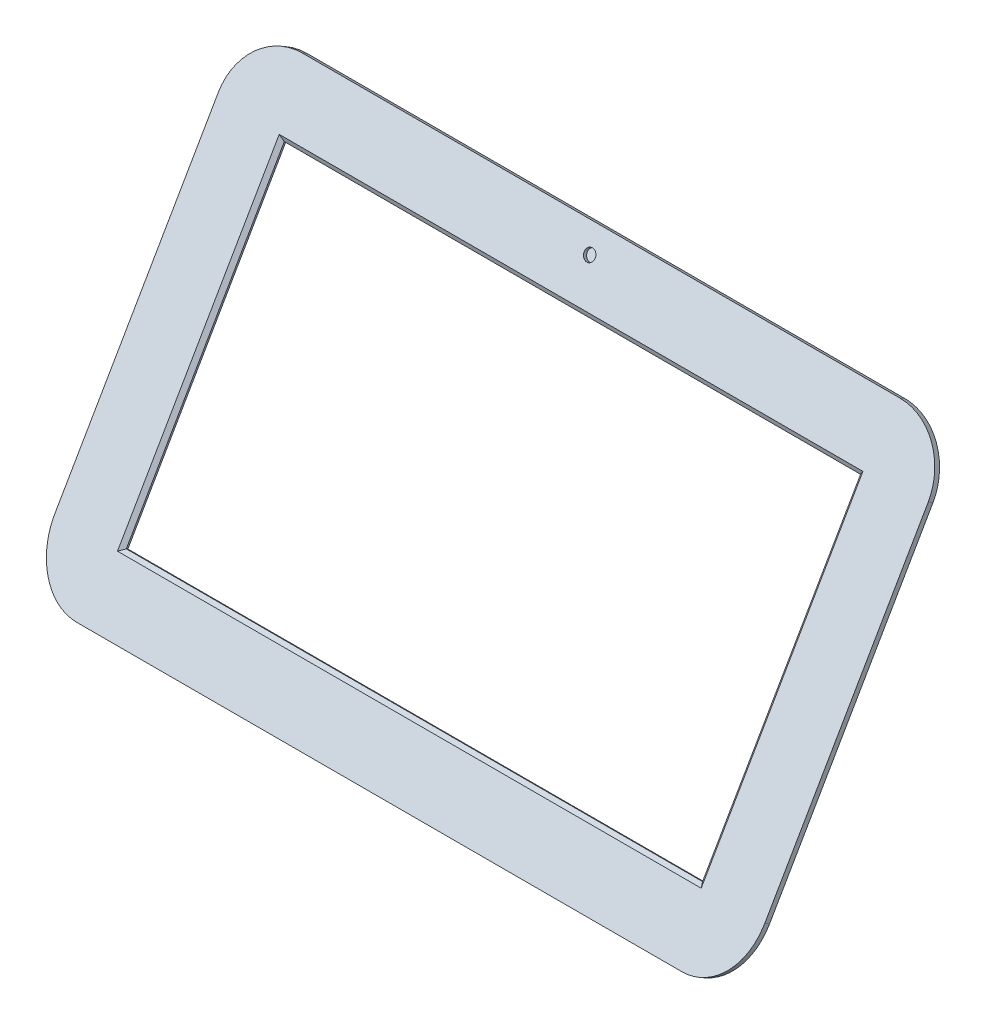
ISO-10303-21;
HEADER;
FILE_DESCRIPTION(('STEP AP214'),'2;1');
FILE_NAME('part.step','',(''),(''),'','','');
FILE_SCHEMA(('AUTOMOTIVE_DESIGN { 1 0 10303 214 1 1 1 1 }'));
ENDSEC;
DATA;
#1=APPLICATION_CONTEXT('core data for automotive mechanical design processes');
#2=APPLICATION_PROTOCOL_DEFINITION('international standard','automotive_design',2000,#1);
#3=PRODUCT_CONTEXT('',#1,'mechanical');
#4=PRODUCT('Part','Part','',(#3));
#5=PRODUCT_RELATED_PRODUCT_CATEGORY('part','',(#4));
#6=PRODUCT_DEFINITION_FORMATION('','',#4);
#7=PRODUCT_DEFINITION_CONTEXT('part definition',#1,'design');
#8=PRODUCT_DEFINITION('design','',#6,#7);
#9=PRODUCT_DEFINITION_SHAPE('','',#8);
#10=(LENGTH_UNIT() NAMED_UNIT(*) SI_UNIT(.MILLI.,.METRE.));
#11=(NAMED_UNIT(*) PLANE_ANGLE_UNIT() SI_UNIT($,.RADIAN.));
#12=(NAMED_UNIT(*) SI_UNIT($,.STERADIAN.) SOLID_ANGLE_UNIT());
#13=UNCERTAINTY_MEASURE_WITH_UNIT(LENGTH_MEASURE(1.E-05),#10,'distance_accuracy_value','');
#14=(GEOMETRIC_REPRESENTATION_CONTEXT(3) GLOBAL_UNCERTAINTY_ASSIGNED_CONTEXT((#13)) GLOBAL_UNIT_ASSIGNED_CONTEXT((#10,
#11,#12)) REPRESENTATION_CONTEXT('',''));
#15=CARTESIAN_POINT('',(0.,0.,0.));
#16=DIRECTION('',(0.,0.,1.));
#17=DIRECTION('',(1.,0.,0.));
#18=AXIS2_PLACEMENT_3D('',#15,#16,#17);
#19=CARTESIAN_POINT('',(-91.243368471321,97.8098890175609,8.79738343873433));
#20=DIRECTION('',(0.,-0.500000000000013,-0.866025403784431));
#21=DIRECTION('',(0.,0.866025403784431,-0.500000000000013));
#22=AXIS2_PLACEMENT_3D('',#19,#20,#21);
#23=PLANE('',#22);
#24=DIRECTION('',(0.,-0.866025403784431,0.500000000000013));
#25=VECTOR('',#24,1.);
#26=CARTESIAN_POINT('',(-77.5000000000063,86.5510975370766,15.2976497307421));
#27=LINE('',#26,#25);
#28=CARTESIAN_POINT('',(-77.5000000000064,86.5510975370772,15.2976497307417));
#29=VERTEX_POINT('',#28);
#30=CARTESIAN_POINT('',(-77.5000000000063,12.9389382154005,57.7976497307428));
#31=VERTEX_POINT('',#30);
#32=EDGE_CURVE('E152',#29,#31,#27,.T.);
#33=ORIENTED_EDGE('',*,*,#32,.T.);
#34=DIRECTION('',(1.,0.,0.));
#35=VECTOR('',#34,1.);
#36=CARTESIAN_POINT('',(-77.5000000000063,12.9389382154005,57.7976497307428));
#37=LINE('',#36,#35);
#38=CARTESIAN_POINT('',(77.4999999999937,12.9389382154005,57.7976497307428));
#39=VERTEX_POINT('',#38);
#40=EDGE_CURVE('E136',#31,#39,#37,.T.);
#41=ORIENTED_EDGE('',*,*,#40,.T.);
#42=DIRECTION('',(0.,-0.866025403784431,0.500000000000013));
#43=VECTOR('',#42,1.);
#44=CARTESIAN_POINT('',(77.4999999999937,86.5510975370765,15.2976497307421));
#45=LINE('',#44,#43);
#46=CARTESIAN_POINT('',(77.4999999999937,86.5510975370772,15.2976497307417));
#47=VERTEX_POINT('',#46);
#48=EDGE_CURVE('E160',#47,#39,#45,.T.);
#49=ORIENTED_EDGE('',*,*,#48,.F.);
#50=DIRECTION('',(1.,0.,0.));
#51=VECTOR('',#50,1.);
#52=CARTESIAN_POINT('',(-77.5000000000063,86.5510975370772,15.2976497307417));
#53=LINE('',#52,#51);
#54=EDGE_CURVE('E158',#29,#47,#53,.T.);
#55=ORIENTED_EDGE('',*,*,#54,.F.);
#56=EDGE_LOOP('',(#33,#41,#49,#55));
#57=FACE_BOUND('',#56,.T.);
#58=CARTESIAN_POINT('',(-80.4040299944083,101.397696376374,6.72596189432287));
#59=CARTESIAN_POINT('',(-81.3948223548655,101.397696376374,6.7259618943229));
#60=CARTESIAN_POINT('',(-82.3692781383816,101.31449137796,6.77400032255501));
#61=CARTESIAN_POINT('',(-83.8074395657664,101.069881022899,6.91522617689611));
#62=CARTESIAN_POINT('',(-84.2828775838439,100.968230667619,6.97391403688055));
#63=CARTESIAN_POINT('',(-85.2256744902742,100.72378155869,7.11504679572367));
#64=CARTESIAN_POINT('',(-85.6946693597111,100.580197274862,7.19794522064315));
#65=CARTESIAN_POINT('',(-87.0598005687776,100.096022316201,7.47748376336091));
#66=CARTESIAN_POINT('',(-87.9235229743241,99.7007861257322,7.70567348432175));
#67=CARTESIAN_POINT('',(-89.1501259978174,99.0001385666802,8.11019254114745));
#68=CARTESIAN_POINT('',(-89.5480970957303,98.7480201437356,8.2557531805022));
#69=CARTESIAN_POINT('',(-90.3171091558551,98.2081560492756,8.5674438607645));
#70=CARTESIAN_POINT('',(-90.6831334808004,97.9240298776957,8.73148418240996));
#71=CARTESIAN_POINT('',(-91.7274993904246,97.030403828854,9.24741942226359));
#72=CARTESIAN_POINT('',(-92.3526437386761,96.3800479708188,9.62290255196924));
#73=CARTESIAN_POINT('',(-93.1811945646513,95.3206738963222,10.2345324590524));
#74=CARTESIAN_POINT('',(-93.4393332415242,94.9525000148915,10.447097748605));
#75=CARTESIAN_POINT('',(-93.9071762318826,94.2040498324152,10.8792156629327));
#76=CARTESIAN_POINT('',(-94.3298498559009,93.4397180496242,11.3205028234773));
#77=CARTESIAN_POINT('',(-94.6636604753382,92.6441419338732,11.7798289080669));
#78=CARTESIAN_POINT('',(-94.952479334074,91.8327466641511,12.2482881854602));
#79=CARTESIAN_POINT('',(-95.0747206558578,91.4176858719899,12.4879236455446));
#80=CARTESIAN_POINT('',(-95.3688217585001,90.1578936145905,13.2152650444771));
#81=CARTESIAN_POINT('',(-95.4671375009985,89.3088650710415,13.7054519026448));
#82=CARTESIAN_POINT('',(-95.4671375009985,88.450616589797,14.2009618943229));
#83=B_SPLINE_CURVE_WITH_KNOTS('',3,(#58,#59,#60,#61,#62,#63,#64,#65,#66,#67,#68,#69,#70,#71,#72,
#73,#74,#75,#76,#77,#78,#79,#80,#81,#82),.UNSPECIFIED.,.F.,.F.,(4,2,2,2,2,2,2,2,2,1,2,2,4),(0.,
0.125000000000001,0.187500000000001,0.250000000000002,0.375000000000002,0.437500000000003,
0.500000000000004,0.625000000000005,0.687500000000004,0.750000000000003,0.812500000000002,
0.875000000000002,1.),.UNSPECIFIED.);
#84=CARTESIAN_POINT('',(-80.4040299944083,101.397696376374,6.72596189432292));
#85=VERTEX_POINT('',#84);
#86=CARTESIAN_POINT('',(-95.4671375009985,88.450616589797,14.200961894323));
#87=VERTEX_POINT('',#86);
#88=EDGE_CURVE('E171',#85,#87,#83,.T.);
#89=ORIENTED_EDGE('',*,*,#88,.F.);
#90=DIRECTION('',(-1.,0.,0.));
#91=VECTOR('',#90,1.);
#92=CARTESIAN_POINT('',(80.4040299944083,101.397696376374,6.7259618943229));
#93=LINE('',#92,#91);
#94=CARTESIAN_POINT('',(80.4040299944083,101.397696376374,6.72596189432292));
#95=VERTEX_POINT('',#94);
#96=EDGE_CURVE('E172',#95,#85,#93,.T.);
#97=ORIENTED_EDGE('',*,*,#96,.F.);
#98=CARTESIAN_POINT('',(95.4671375009985,88.450616589797,14.200961894323));
#99=CARTESIAN_POINT('',(95.4671375009985,89.3087376787211,13.7055254526353));
#100=CARTESIAN_POINT('',(95.3688626037767,90.1523443810771,13.2184688959399));
#101=CARTESIAN_POINT('',(95.0801849857442,91.396890726509,12.4999297283858));
#102=CARTESIAN_POINT('',(94.9602387562703,91.8082362085167,12.2624393036188));
#103=CARTESIAN_POINT('',(94.671828384446,92.6237614795333,11.7915955688664));
#104=CARTESIAN_POINT('',(94.5026566154436,93.0287622328838,11.5577682748975));
#105=CARTESIAN_POINT('',(93.9330775179096,94.2062188796331,10.8779633629377));
#106=CARTESIAN_POINT('',(93.4685509932601,94.9505052660113,10.448249417408));
#107=CARTESIAN_POINT('',(92.6458218387159,96.0065176724673,9.83856037027303));
#108=CARTESIAN_POINT('',(92.3489745135458,96.3498747342454,9.64032307822729));
#109=CARTESIAN_POINT('',(91.7183404241747,97.0083465680696,9.26015418771511));
#110=CARTESIAN_POINT('',(91.386598168243,97.321666376798,9.07925891180331));
#111=CARTESIAN_POINT('',(90.3436414333809,98.2153752368224,8.56327586089109));
#112=CARTESIAN_POINT('',(89.5851438677068,98.7499467511264,8.25464085320657));
#113=CARTESIAN_POINT('',(88.3503725998366,99.4577864120997,7.8459694344005));
#114=CARTESIAN_POINT('',(87.9239424026546,99.6768261398017,7.71950678864858));
#115=CARTESIAN_POINT('',(87.056813873501,100.074173380874,7.49009825205374));
#116=CARTESIAN_POINT('',(86.1712832459879,100.433234469035,7.28279423614867));
#117=CARTESIAN_POINT('',(85.2494766064435,100.716822156473,7.1190648084675));
#118=CARTESIAN_POINT('',(84.309272774014,100.962133896995,6.97743400904152));
#119=CARTESIAN_POINT('',(83.8276924557943,101.065983667004,6.91747631637127));
#120=CARTESIAN_POINT('',(82.3744150024815,101.314501965636,6.77399420975752));
#121=CARTESIAN_POINT('',(81.3947006203572,101.397696376374,6.72596189432292));
#122=CARTESIAN_POINT('',(80.4040299944083,101.397696376374,6.72596189432292));
#123=B_SPLINE_CURVE_WITH_KNOTS('',3,(#98,#99,#100,#101,#102,#103,#104,#105,#106,#107,#108,#109,
#110,#111,#112,#113,#114,#115,#116,#117,#118,#119,#120,#121,#122),.UNSPECIFIED.,.F.,.F.,(4,2,2,
2,2,2,2,2,2,1,2,2,4),(0.,0.125000000000001,0.187500000000001,0.250000000000002,
0.375000000000001,0.437500000000001,0.5,0.625000000000001,0.687500000000001,0.750000000000001,
0.812500000000001,0.875000000000001,1.),.UNSPECIFIED.);
#124=CARTESIAN_POINT('',(95.4671375009985,88.450616589797,14.2009618943231));
#125=VERTEX_POINT('',#124);
#126=EDGE_CURVE('E190',#125,#95,#123,.T.);
#127=ORIENTED_EDGE('',*,*,#126,.F.);
#128=DIRECTION('',(0.,0.866025403784431,-0.500000000000013));
#129=VECTOR('',#128,1.);
#130=CARTESIAN_POINT('',(95.4671375009985,12.2889438616136,58.1729241458734));
#131=LINE('',#130,#129);
#132=CARTESIAN_POINT('',(95.4671375009985,12.2889438616111,58.1729241458737));
#133=VERTEX_POINT('',#132);
#134=EDGE_CURVE('E191',#133,#125,#131,.T.);
#135=ORIENTED_EDGE('',*,*,#134,.F.);
#136=CARTESIAN_POINT('',(81.3716741730097,-1.90766062413412,66.3693375672975));
#137=CARTESIAN_POINT('',(82.3833324529644,-1.90766062413415,66.3693375672975));
#138=CARTESIAN_POINT('',(83.3748076861724,-1.80552783785332,66.3103711756451));
#139=CARTESIAN_POINT('',(84.832340406449,-1.50213754186482,66.1352087065867));
#140=CARTESIAN_POINT('',(85.315149110908,-1.37515464253808,66.0618950954779));
#141=CARTESIAN_POINT('',(86.2617486241119,-1.07180837118935,65.886758044057));
#142=CARTESIAN_POINT('',(86.7204782091141,-0.897310132543572,65.7860114390018));
#143=CARTESIAN_POINT('',(87.6103231753475,-0.505054244048356,65.5595423961878));
#144=CARTESIAN_POINT('',(88.0414327377717,-0.287287478666423,65.433814695574));
#145=CARTESIAN_POINT('',(88.8766286129636,0.190579695994536,65.1579179536466));
#146=CARTESIAN_POINT('',(89.2828135025568,0.45223596345953,65.0068506371906));
#147=CARTESIAN_POINT('',(90.4441214608226,1.28874427215837,64.5238923399839));
#148=CARTESIAN_POINT('',(91.1390566910797,1.91048381407118,64.1649308480947));
#149=CARTESIAN_POINT('',(92.0741939542676,2.92978687721233,63.5764359502043));
#150=CARTESIAN_POINT('',(92.3691336568355,3.2858767527988,63.3708473646788));
#151=CARTESIAN_POINT('',(92.9161550023151,4.01701991880987,62.9487216609662));
#152=CARTESIAN_POINT('',(93.1682585439557,4.39164376640067,62.7324324817148));
#153=CARTESIAN_POINT('',(93.8645112920814,5.54091150956368,62.0689024408286));
#154=CARTESIAN_POINT('',(94.2490192582888,6.34094885713561,61.6070006628462));
#155=CARTESIAN_POINT('',(94.8665593156767,8.00438134571002,60.646617467789));
#156=CARTESIAN_POINT('',(95.091979195613,8.84722964957307,60.1599987726676));
#157=CARTESIAN_POINT('',(95.3923508095515,10.5530224465655,59.1751588421423));
#158=CARTESIAN_POINT('',(95.4671375009985,11.4159889824097,58.676924880371));
#159=CARTESIAN_POINT('',(95.4671375009985,12.2889438616111,58.1729241458737));
#160=B_SPLINE_CURVE_WITH_KNOTS('',3,(#136,#137,#138,#139,#140,#141,#142,#143,#144,#145,#146,
#147,#148,#149,#150,#151,#152,#153,#154,#155,#156,#157,#158,#159),.UNSPECIFIED.,.F.,.F.,(4,2,2,
2,2,2,2,2,2,2,2,4),(0.,0.124999999999999,0.187499999999998,0.249999999999998,0.312499999999997,
0.374999999999997,0.499999999999997,0.562499999999998,0.624999999999998,0.749999999999999,
0.874999999999999,1.),.UNSPECIFIED.);
#161=CARTESIAN_POINT('',(81.3716741730097,-1.90766062413353,66.3693375672985));
#162=VERTEX_POINT('',#161);
#163=EDGE_CURVE('E194',#162,#133,#160,.T.);
#164=ORIENTED_EDGE('',*,*,#163,.F.);
#165=DIRECTION('',(1.,0.,0.));
#166=VECTOR('',#165,1.);
#167=CARTESIAN_POINT('',(-81.3716741730097,-1.90766062413354,66.3693375672985));
#168=LINE('',#167,#166);
#169=CARTESIAN_POINT('',(-81.3716741730097,-1.90766062413411,66.3693375672975));
#170=VERTEX_POINT('',#169);
#171=EDGE_CURVE('E197',#170,#162,#168,.T.);
#172=ORIENTED_EDGE('',*,*,#171,.F.);
#173=CARTESIAN_POINT('',(-95.4671375009985,12.2889438616111,58.1729241458737));
#174=CARTESIAN_POINT('',(-95.4671375009985,11.4150109595226,58.6774895421482));
#175=CARTESIAN_POINT('',(-95.3921825594424,10.5518940212021,59.1758103388297));
#176=CARTESIAN_POINT('',(-95.0919697056343,8.84734879445528,60.1599299843379));
#177=CARTESIAN_POINT('',(-94.8668617067419,8.00589887359987,60.6457413226533));
#178=CARTESIAN_POINT('',(-94.4053134632064,6.7616007208096,61.364137196119));
#179=CARTESIAN_POINT('',(-94.2305009189646,6.35013738546084,61.6016956635442));
#180=CARTESIAN_POINT('',(-93.8450316405689,5.55048386930865,62.0633758363531));
#181=CARTESIAN_POINT('',(-93.6336154203935,5.16013651394166,62.2887429870517));
#182=CARTESIAN_POINT('',(-92.9423383374533,4.01803179434174,62.9481374543555));
#183=CARTESIAN_POINT('',(-92.4060972926103,3.29488284667574,63.3656476939546));
#184=CARTESIAN_POINT('',(-91.4746098537641,2.27466560015864,63.9546703958632));
#185=CARTESIAN_POINT('',(-91.1404255663542,1.94342420864756,64.1459127024189));
#186=CARTESIAN_POINT('',(-90.4387908106654,1.31689654774118,64.5076386160979));
#187=CARTESIAN_POINT('',(-90.0716519232689,1.02142398517455,64.6782297796339));
#188=CARTESIAN_POINT('',(-89.3041605975665,0.466683304232107,64.9985094611065));
#189=CARTESIAN_POINT('',(-88.9038122729117,0.207410701769398,65.1482005679318));
#190=CARTESIAN_POINT('',(-88.0682579657976,-0.27313789959954,65.4256454322909));
#191=CARTESIAN_POINT('',(-87.6301066156459,-0.495662600400182,65.5541201281995));
#192=CARTESIAN_POINT('',(-86.2820778529992,-1.09187045045436,65.8983408909212));
#193=CARTESIAN_POINT('',(-85.3465432213382,-1.39310361408887,66.0722579390344));
#194=CARTESIAN_POINT('',(-83.8876401569224,-1.69973878803489,66.2492938392552));
#195=CARTESIAN_POINT('',(-83.3901951943129,-1.77775128655622,66.2943343762766));
#196=CARTESIAN_POINT('',(-82.3840243372318,-1.88179647061065,66.3544048912983));
#197=CARTESIAN_POINT('',(-81.8788713863684,-1.9076606241341,66.3693375672975));
#198=CARTESIAN_POINT('',(-81.3716741730097,-1.90766062413411,66.3693375672975));
#199=B_SPLINE_CURVE_WITH_KNOTS('',3,(#173,#174,#175,#176,#177,#178,#179,#180,#181,#182,#183,
#184,#185,#186,#187,#188,#189,#190,#191,#192,#193,#194,#195,#196,#197,#198),.UNSPECIFIED.,.F.,
.F.,(4,2,2,2,2,2,2,2,2,2,2,2,4),(0.,0.125,0.25,0.312500000000001,0.375000000000001,
0.500000000000001,0.562500000000001,0.625000000000001,0.6875,0.75,0.875,0.9375,1.),.UNSPECIFIED.);
#200=CARTESIAN_POINT('',(-95.4671375009985,12.2889438616116,58.1729241458745));
#201=VERTEX_POINT('',#200);
#202=EDGE_CURVE('E210',#201,#170,#199,.T.);
#203=ORIENTED_EDGE('',*,*,#202,.F.);
#204=DIRECTION('',(0.,-0.866025403784431,0.500000000000013));
#205=VECTOR('',#204,1.);
#206=CARTESIAN_POINT('',(-95.4671375009985,88.450616589799,14.2009618943218));
#207=LINE('',#206,#205);
#208=EDGE_CURVE('E211',#87,#201,#207,.T.);
#209=ORIENTED_EDGE('',*,*,#208,.F.);
#210=EDGE_LOOP('',(#89,#97,#127,#135,#164,#172,#203,#209));
#211=FACE_BOUND('',#210,.T.);
#212=ADVANCED_FACE('F33',(#57,#211),#23,.T.);
#213=CARTESIAN_POINT('',(-91.0312554506751,98.3761545280819,10.2025007013711));
#214=DIRECTION('',(0.,-0.500000000000025,-0.866025403784424));
#215=DIRECTION('',(0.,0.866025403784424,-0.500000000000025));
#216=AXIS2_PLACEMENT_3D('',#213,#214,#215);
#217=PLANE('',#216);
#218=CARTESIAN_POINT('',(0.,96.8273769787125,11.0966878364145));
#219=DIRECTION('',(0.,0.500000000000025,0.866025403784424));
#220=DIRECTION('',(0.,-0.866025403784424,0.500000000000025));
#221=AXIS2_PLACEMENT_3D('',#218,#219,#220);
#222=CIRCLE('',#221,1.49999999995872);
#223=CARTESIAN_POINT('',(0.,95.5283388730716,11.8466878363939));
#224=VERTEX_POINT('',#223);
#225=EDGE_CURVE('E515',#224,#224,#222,.T.);
#226=ORIENTED_EDGE('',*,*,#225,.F.);
#227=EDGE_LOOP('',(#226));
#228=FACE_BOUND('',#227,.T.);
#229=DIRECTION('',(0.,-0.866025403784424,0.500000000000025));
#230=VECTOR('',#229,1.);
#231=CARTESIAN_POINT('',(78.4999999999937,13.6889382154013,59.0966878364207));
#232=LINE('',#231,#230);
#233=CARTESIAN_POINT('',(78.4999999999937,88.1671229408618,16.0966878364186));
#234=VERTEX_POINT('',#233);
#235=CARTESIAN_POINT('',(78.4999999999937,12.8229128116169,59.5966878364208));
#236=VERTEX_POINT('',#235);
#237=EDGE_CURVE('E443',#234,#236,#232,.T.);
#238=ORIENTED_EDGE('',*,*,#237,.T.);
#239=DIRECTION('',(-1.,0.,0.));
#240=VECTOR('',#239,1.);
#241=CARTESIAN_POINT('',(-91.0312554506751,12.8229128116168,59.5966878364206));
#242=LINE('',#241,#240);
#243=CARTESIAN_POINT('',(-78.5000000000063,12.8229128116168,59.5966878364206));
#244=VERTEX_POINT('',#243);
#245=EDGE_CURVE('E438',#236,#244,#242,.T.);
#246=ORIENTED_EDGE('',*,*,#245,.T.);
#247=DIRECTION('',(0.,0.866025403784424,-0.500000000000025));
#248=VECTOR('',#247,1.);
#249=CARTESIAN_POINT('',(-78.5000000000064,98.3761545280819,10.2025007013711));
#250=LINE('',#249,#248);
#251=CARTESIAN_POINT('',(-78.5000000000064,88.1671229408618,16.0966878364185));
#252=VERTEX_POINT('',#251);
#253=EDGE_CURVE('E423',#244,#252,#250,.T.);
#254=ORIENTED_EDGE('',*,*,#253,.T.);
#255=DIRECTION('',(1.,0.,0.));
#256=VECTOR('',#255,1.);
#257=CARTESIAN_POINT('',(77.4999999999937,88.1671229408618,16.0966878364186));
#258=LINE('',#257,#256);
#259=EDGE_CURVE('E441',#252,#234,#258,.T.);
#260=ORIENTED_EDGE('',*,*,#259,.T.);
#261=EDGE_LOOP('',(#238,#246,#254,#260));
#262=FACE_BOUND('',#261,.T.);
#263=CARTESIAN_POINT('',(-95.4671375009985,89.200616589797,15.4999999999996));
#264=CARTESIAN_POINT('',(-95.4671375009985,90.0588650710415,15.0044900083215));
#265=CARTESIAN_POINT('',(-95.3688217585001,90.9078936145905,14.5143031501538));
#266=CARTESIAN_POINT('',(-95.0747206558578,92.1676858719899,13.7869617512212));
#267=CARTESIAN_POINT('',(-94.952479334074,92.5827466641511,13.5473262911369));
#268=CARTESIAN_POINT('',(-94.6636604753382,93.3941419338732,13.0788670137436));
#269=CARTESIAN_POINT('',(-94.3298498559009,94.1897180496242,12.619540929154));
#270=CARTESIAN_POINT('',(-93.9071762318826,94.9540498324152,12.1782537686094));
#271=CARTESIAN_POINT('',(-93.4393332415242,95.7025000148915,11.7461358542817));
#272=CARTESIAN_POINT('',(-93.1811945646513,96.0706738963223,11.533570564729));
#273=CARTESIAN_POINT('',(-92.3526437386761,97.1300479708189,10.9219406576459));
#274=CARTESIAN_POINT('',(-91.7274993904246,97.780403828854,10.5464575279403));
#275=CARTESIAN_POINT('',(-90.6831334808004,98.6740298776957,10.0305222880866));
#276=CARTESIAN_POINT('',(-90.3171091558551,98.9581560492756,9.86648196644116));
#277=CARTESIAN_POINT('',(-89.5480970957303,99.4980201437356,9.55479128617887));
#278=CARTESIAN_POINT('',(-89.1501259978174,99.7501385666803,9.40923064682411));
#279=CARTESIAN_POINT('',(-87.9235229743241,100.450786125732,9.00471158999841));
#280=CARTESIAN_POINT('',(-87.0598005687776,100.846022316201,8.77652186903757));
#281=CARTESIAN_POINT('',(-85.6946693597111,101.330197274862,8.49698332631982));
#282=CARTESIAN_POINT('',(-85.2256744902742,101.47378155869,8.41408490140033));
#283=CARTESIAN_POINT('',(-84.2828775838439,101.718230667619,8.27295214255722));
#284=CARTESIAN_POINT('',(-83.8074395657664,101.819881022899,8.21426428257277));
#285=CARTESIAN_POINT('',(-82.3692781383816,102.06449137796,8.07303842823168));
#286=CARTESIAN_POINT('',(-81.3948223548655,102.147696376374,8.02499999999956));
#287=CARTESIAN_POINT('',(-80.4040299944083,102.147696376374,8.02499999999953));
#288=B_SPLINE_CURVE_WITH_KNOTS('',3,(#263,#264,#265,#266,#267,#268,#269,#270,#271,#272,#273,
#274,#275,#276,#277,#278,#279,#280,#281,#282,#283,#284,#285,#286,#287),.UNSPECIFIED.,.F.,.F.,(4,
2,2,1,2,2,2,2,2,2,2,2,4),(0.,0.124999999999998,0.187499999999998,0.249999999999997,
0.312499999999996,0.374999999999995,0.499999999999996,0.562499999999997,0.624999999999998,
0.749999999999998,0.812499999999999,0.874999999999999,1.),.UNSPECIFIED.);
#289=CARTESIAN_POINT('',(-80.4040299944083,102.147696376374,8.02499999999955));
#290=VERTEX_POINT('',#289);
#291=CARTESIAN_POINT('',(-95.4671375009985,89.200616589797,15.4999999999996));
#292=VERTEX_POINT('',#291);
#293=EDGE_CURVE('E147',#290,#292,#288,.F.);
#294=ORIENTED_EDGE('',*,*,#293,.T.);
#295=DIRECTION('',(0.,-0.866025403784436,0.500000000000004));
#296=VECTOR('',#295,1.);
#297=CARTESIAN_POINT('',(-95.4671375009985,89.200616589797,15.4999999999996));
#298=LINE('',#297,#296);
#299=CARTESIAN_POINT('',(-95.4671375009985,13.0389438616111,59.4719622515503));
#300=VERTEX_POINT('',#299);
#301=EDGE_CURVE('E345',#292,#300,#298,.T.);
#302=ORIENTED_EDGE('',*,*,#301,.T.);
#303=CARTESIAN_POINT('',(-81.3716741730097,-1.15766062413415,67.6683756729741));
#304=CARTESIAN_POINT('',(-81.8788713863684,-1.15766062413414,67.668375672974));
#305=CARTESIAN_POINT('',(-82.3840243372318,-1.13179647061069,67.6534429969749));
#306=CARTESIAN_POINT('',(-83.3901951943129,-1.02775128655626,67.5933724819532));
#307=CARTESIAN_POINT('',(-83.8876401569224,-0.949738788034935,67.5483319449318));
#308=CARTESIAN_POINT('',(-85.3465432213382,-0.643103614088911,67.371296044711));
#309=CARTESIAN_POINT('',(-86.2820778529992,-0.341870450454404,67.1973789965978));
#310=CARTESIAN_POINT('',(-87.6301066156459,0.254337399599777,66.8531582338761));
#311=CARTESIAN_POINT('',(-88.0682579657976,0.476862100400419,66.7246835379675));
#312=CARTESIAN_POINT('',(-88.9038122729117,0.957410701769357,66.4472386736084));
#313=CARTESIAN_POINT('',(-89.3041605975665,1.21668330423207,66.2975475667831));
#314=CARTESIAN_POINT('',(-90.0716519232689,1.77142398517451,65.9772678853105));
#315=CARTESIAN_POINT('',(-90.4387908106654,2.06689654774114,65.8066767217745));
#316=CARTESIAN_POINT('',(-91.1404255663542,2.69342420864752,65.4449508080955));
#317=CARTESIAN_POINT('',(-91.4746098537641,3.0246656001586,65.2537085015398));
#318=CARTESIAN_POINT('',(-92.4060972926103,4.0448828466757,64.6646857996312));
#319=CARTESIAN_POINT('',(-92.9423383374533,4.7680317943417,64.2471755600321));
#320=CARTESIAN_POINT('',(-93.6336154203935,5.91013651394162,63.5877810927283));
#321=CARTESIAN_POINT('',(-93.8450316405689,6.30048386930861,63.3624139420297));
#322=CARTESIAN_POINT('',(-94.2305009189646,7.10013738546079,62.9007337692208));
#323=CARTESIAN_POINT('',(-94.4053134632064,7.51160072080956,62.6631753017955));
#324=CARTESIAN_POINT('',(-94.8668617067419,8.75589887359983,61.9447794283299));
#325=CARTESIAN_POINT('',(-95.0919697056343,9.59734879445524,61.4589680900144));
#326=CARTESIAN_POINT('',(-95.3921825594424,11.301894021202,60.4748484445063));
#327=CARTESIAN_POINT('',(-95.4671375009985,12.1650109595226,59.9765276478248));
#328=CARTESIAN_POINT('',(-95.4671375009985,13.0389438616111,59.4719622515503));
#329=B_SPLINE_CURVE_WITH_KNOTS('',3,(#303,#304,#305,#306,#307,#308,#309,#310,#311,#312,#313,
#314,#315,#316,#317,#318,#319,#320,#321,#322,#323,#324,#325,#326,#327,#328),.UNSPECIFIED.,.F.,
.F.,(4,2,2,2,2,2,2,2,2,2,2,2,4),(0.,0.0624999999999999,0.125,0.25,0.3125,0.374999999999999,
0.437499999999999,0.499999999999999,0.624999999999999,0.687499999999999,0.75,0.875,1.),.UNSPECIFIED.);
#330=CARTESIAN_POINT('',(-81.3716741730097,-1.15766062413413,67.6683756729741));
#331=VERTEX_POINT('',#330);
#332=EDGE_CURVE('E339',#300,#331,#329,.F.);
#333=ORIENTED_EDGE('',*,*,#332,.T.);
#334=DIRECTION('',(1.,0.,0.));
#335=VECTOR('',#334,1.);
#336=CARTESIAN_POINT('',(-81.3716741730097,-1.15766062413413,67.6683756729741));
#337=LINE('',#336,#335);
#338=CARTESIAN_POINT('',(81.3716741730097,-1.15766062413413,67.6683756729741));
#339=VERTEX_POINT('',#338);
#340=EDGE_CURVE('E334',#331,#339,#337,.T.);
#341=ORIENTED_EDGE('',*,*,#340,.T.);
#342=CARTESIAN_POINT('',(95.4671375009985,13.0389438616111,59.4719622515504));
#343=CARTESIAN_POINT('',(95.4671375009985,12.1659889824097,59.9759629860477));
#344=CARTESIAN_POINT('',(95.3923508095515,11.3030224465655,60.474196947819));
#345=CARTESIAN_POINT('',(95.091979195613,9.59722964957307,61.4590368783443));
#346=CARTESIAN_POINT('',(94.8665593156767,8.75438134571002,61.9456555734656));
#347=CARTESIAN_POINT('',(94.2490192582888,7.09094885713561,62.9060387685229));
#348=CARTESIAN_POINT('',(93.8645112920814,6.29091150956368,63.3679405465053));
#349=CARTESIAN_POINT('',(93.1682585439557,5.14164376640067,64.0314705873914));
#350=CARTESIAN_POINT('',(92.9161550023151,4.76701991880987,64.2477597666428));
#351=CARTESIAN_POINT('',(92.3691336568355,4.0358767527988,64.6698854703554));
#352=CARTESIAN_POINT('',(92.0741939542676,3.67978687721233,64.875474055881));
#353=CARTESIAN_POINT('',(91.1390566910797,2.66048381407118,65.4639689537714));
#354=CARTESIAN_POINT('',(90.4441214608226,2.03874427215837,65.8229304456605));
#355=CARTESIAN_POINT('',(89.2828135025568,1.20223596345953,66.3058887428672));
#356=CARTESIAN_POINT('',(88.8766286129636,0.940579695994537,66.4569560593232));
#357=CARTESIAN_POINT('',(88.0414327377717,0.462712521333578,66.7328528012507));
#358=CARTESIAN_POINT('',(87.6103231753475,0.244945755951645,66.8585805018645));
#359=CARTESIAN_POINT('',(86.7204782091141,-0.147310132543571,67.0850495446784));
#360=CARTESIAN_POINT('',(86.2617486241119,-0.32180837118935,67.1857961497337));
#361=CARTESIAN_POINT('',(85.315149110908,-0.625154642538081,67.3609332011545));
#362=CARTESIAN_POINT('',(84.832340406449,-0.752137541864817,67.4342468122633));
#363=CARTESIAN_POINT('',(83.3748076861724,-1.05552783785332,67.6094092813218));
#364=CARTESIAN_POINT('',(82.3833324529644,-1.15766062413415,67.6683756729741));
#365=CARTESIAN_POINT('',(81.3716741730097,-1.15766062413412,67.6683756729741));
#366=B_SPLINE_CURVE_WITH_KNOTS('',3,(#342,#343,#344,#345,#346,#347,#348,#349,#350,#351,#352,
#353,#354,#355,#356,#357,#358,#359,#360,#361,#362,#363,#364,#365),.UNSPECIFIED.,.F.,.F.,(4,2,2,
2,2,2,2,2,2,2,2,4),(0.,0.125000000000001,0.250000000000001,0.375000000000002,0.437500000000002,
0.500000000000003,0.625000000000003,0.687500000000003,0.750000000000002,0.812500000000002,
0.875000000000001,1.),.UNSPECIFIED.);
#367=CARTESIAN_POINT('',(95.4671375009985,13.0389438616111,59.4719622515503));
#368=VERTEX_POINT('',#367);
#369=EDGE_CURVE('E338',#339,#368,#366,.F.);
#370=ORIENTED_EDGE('',*,*,#369,.T.);
#371=DIRECTION('',(0.,0.866025403784436,-0.500000000000004));
#372=VECTOR('',#371,1.);
#373=CARTESIAN_POINT('',(95.4671375009985,13.0389438616111,59.4719622515503));
#374=LINE('',#373,#372);
#375=CARTESIAN_POINT('',(95.4671375009985,89.200616589797,15.4999999999996));
#376=VERTEX_POINT('',#375);
#377=EDGE_CURVE('E270',#368,#376,#374,.T.);
#378=ORIENTED_EDGE('',*,*,#377,.T.);
#379=CARTESIAN_POINT('',(80.4040299944083,102.147696376374,8.02499999999953));
#380=CARTESIAN_POINT('',(81.3947006203572,102.147696376374,8.02499999999953));
#381=CARTESIAN_POINT('',(82.3744150024815,102.064501965636,8.07303231543413));
#382=CARTESIAN_POINT('',(83.8276924557943,101.815983667004,8.21651442204788));
#383=CARTESIAN_POINT('',(84.309272774014,101.712133896995,8.27647211471813));
#384=CARTESIAN_POINT('',(85.2494766064435,101.466822156473,8.4181029141441));
#385=CARTESIAN_POINT('',(86.1712832459879,101.183234469035,8.58183234182527));
#386=CARTESIAN_POINT('',(87.056813873501,100.824173380874,8.78913635773035));
#387=CARTESIAN_POINT('',(87.9239424026546,100.426826139802,9.01854489432519));
#388=CARTESIAN_POINT('',(88.3503725998366,100.2077864121,9.1450075400771));
#389=CARTESIAN_POINT('',(89.5851438677068,99.4999467511263,9.55367895888318));
#390=CARTESIAN_POINT('',(90.3436414333809,98.9653752368224,9.8623139665677));
#391=CARTESIAN_POINT('',(91.386598168243,98.071666376798,10.3782970174799));
#392=CARTESIAN_POINT('',(91.7183404241747,97.7583465680696,10.5591922933917));
#393=CARTESIAN_POINT('',(92.3489745135458,97.0998747342454,10.9393611839039));
#394=CARTESIAN_POINT('',(92.6458218387159,96.7565176724673,11.1375984759496));
#395=CARTESIAN_POINT('',(93.4685509932601,95.7005052660113,11.7472875230846));
#396=CARTESIAN_POINT('',(93.9330775179096,94.956218879633,12.1770014686143));
#397=CARTESIAN_POINT('',(94.5026566154436,93.7787622328838,12.8568063805741));
#398=CARTESIAN_POINT('',(94.671828384446,93.3737614795333,13.090633674543));
#399=CARTESIAN_POINT('',(94.9602387562703,92.5582362085167,13.5614774092954));
#400=CARTESIAN_POINT('',(95.0801849857442,92.146890726509,13.7989678340625));
#401=CARTESIAN_POINT('',(95.3688626037767,90.9023443810771,14.5175070016166));
#402=CARTESIAN_POINT('',(95.4671375009985,90.0587376787211,15.004563558312));
#403=CARTESIAN_POINT('',(95.4671375009985,89.200616589797,15.4999999999996));
#404=B_SPLINE_CURVE_WITH_KNOTS('',3,(#379,#380,#381,#382,#383,#384,#385,#386,#387,#388,#389,
#390,#391,#392,#393,#394,#395,#396,#397,#398,#399,#400,#401,#402,#403),.UNSPECIFIED.,.F.,.F.,(4,
2,2,1,2,2,2,2,2,2,2,2,4),(0.,0.124999999999999,0.187499999999999,0.249999999999999,
0.312499999999999,0.374999999999999,0.5,0.562499999999999,0.624999999999999,0.749999999999998,
0.812499999999999,0.874999999999999,1.),.UNSPECIFIED.);
#405=CARTESIAN_POINT('',(80.4040299944083,102.147696376374,8.02499999999955));
#406=VERTEX_POINT('',#405);
#407=EDGE_CURVE('E281',#376,#406,#404,.F.);
#408=ORIENTED_EDGE('',*,*,#407,.T.);
#409=DIRECTION('',(-1.,0.,0.));
#410=VECTOR('',#409,1.);
#411=CARTESIAN_POINT('',(80.4040299944083,102.147696376374,8.02499999999955));
#412=LINE('',#411,#410);
#413=EDGE_CURVE('E297',#406,#290,#412,.T.);
#414=ORIENTED_EDGE('',*,*,#413,.T.);
#415=EDGE_LOOP('',(#294,#302,#333,#341,#370,#378,#408,#414));
#416=FACE_BOUND('',#415,.T.);
#417=ADVANCED_FACE('F234',(#228,#262,#416),#217,.F.);
#418=CARTESIAN_POINT('',(-95.4671375009985,-24.1162817609269,-180.77062529957));
#419=DIRECTION('',(-1.,0.,0.));
#420=DIRECTION('',(0.,0.,1.));
#421=AXIS2_PLACEMENT_3D('',#418,#419,#420);
#422=PLANE('',#421);
#423=DIRECTION('',(0.,0.500000000000004,0.866025403784436));
#424=VECTOR('',#423,1.);
#425=CARTESIAN_POINT('',(-95.4671375009985,-24.1162817609269,-180.77062529957));
#426=LINE('',#425,#424);
#427=EDGE_CURVE('E212',#87,#292,#426,.T.);
#428=ORIENTED_EDGE('',*,*,#427,.F.);
#429=ORIENTED_EDGE('',*,*,#208,.T.);
#430=DIRECTION('',(0.,0.500000000000004,0.866025403784436));
#431=VECTOR('',#430,1.);
#432=CARTESIAN_POINT('',(-95.4671375009985,-100.277954489113,-136.798663048019));
#433=LINE('',#432,#431);
#434=EDGE_CURVE('E208',#201,#300,#433,.T.);
#435=ORIENTED_EDGE('',*,*,#434,.T.);
#436=ORIENTED_EDGE('',*,*,#301,.F.);
#437=EDGE_LOOP('',(#428,#429,#435,#436));
#438=FACE_BOUND('',#437,.T.);
#439=ADVANCED_FACE('F372',(#438),#422,.T.);
#440=CARTESIAN_POINT('',(-95.4671375009985,-100.277954489113,-136.798663048019));
#441=CARTESIAN_POINT('',(-95.4671375009985,-101.151887391201,-136.294097651745));
#442=CARTESIAN_POINT('',(-95.3921825594424,-102.015004329522,-135.795776855063));
#443=CARTESIAN_POINT('',(-95.0919697056343,-103.719549556269,-134.811657209555));
#444=CARTESIAN_POINT('',(-94.8668617067419,-104.560999477124,-134.32584587124));
#445=CARTESIAN_POINT('',(-94.4053134632064,-105.805297629914,-133.607449997774));
#446=CARTESIAN_POINT('',(-94.2305009189646,-106.216760965263,-133.369891530349));
#447=CARTESIAN_POINT('',(-93.8450316405689,-107.016414481415,-132.90821135754));
#448=CARTESIAN_POINT('',(-93.6336154203935,-107.406761836782,-132.682844206841));
#449=CARTESIAN_POINT('',(-92.9423383374533,-108.548866556382,-132.023449739538));
#450=CARTESIAN_POINT('',(-92.4060972926103,-109.272015504048,-131.605939499938));
#451=CARTESIAN_POINT('',(-91.4746098537641,-110.292232750565,-131.01691679803));
#452=CARTESIAN_POINT('',(-91.1404255663542,-110.623474142076,-130.825674491474));
#453=CARTESIAN_POINT('',(-90.4387908106654,-111.250001802983,-130.463948577795));
#454=CARTESIAN_POINT('',(-90.0716519232689,-111.545474365549,-130.293357414259));
#455=CARTESIAN_POINT('',(-89.3041605975665,-112.100215046492,-129.973077732787));
#456=CARTESIAN_POINT('',(-88.9038122729117,-112.359487648955,-129.823386625961));
#457=CARTESIAN_POINT('',(-88.0682579657976,-112.840036250323,-129.545941761602));
#458=CARTESIAN_POINT('',(-87.6301066156459,-113.062560951124,-129.417467065694));
#459=CARTESIAN_POINT('',(-86.2820778529992,-113.658768801178,-129.073246302972));
#460=CARTESIAN_POINT('',(-85.3465432213382,-113.960001964813,-128.899329254859));
#461=CARTESIAN_POINT('',(-83.8876401569224,-114.266637138759,-128.722293354638));
#462=CARTESIAN_POINT('',(-83.3901951943129,-114.34464963728,-128.677252817616));
#463=CARTESIAN_POINT('',(-82.3840243372318,-114.448694821335,-128.617182302595));
#464=CARTESIAN_POINT('',(-81.8788713863684,-114.474558974858,-128.602249626596));
#465=CARTESIAN_POINT('',(-81.3716741730097,-114.474558974858,-128.602249626596));
#466=B_SPLINE_CURVE_WITH_KNOTS('',3,(#440,#441,#442,#443,#444,#445,#446,#447,#448,#449,#450,
#451,#452,#453,#454,#455,#456,#457,#458,#459,#460,#461,#462,#463,#464,#465),.UNSPECIFIED.,.F.,
.F.,(4,2,2,2,2,2,2,2,2,2,2,2,4),(0.,0.125,0.25,0.312500000000001,0.375000000000001,
0.500000000000001,0.562500000000001,0.625000000000001,0.6875,0.75,0.875,0.9375,1.),.UNSPECIFIED.);
#467=DIRECTION('',(0.,0.500000000000004,0.866025403784436));
#468=VECTOR('',#467,1.);
#469=SURFACE_OF_LINEAR_EXTRUSION('',#466,#468);
#470=ORIENTED_EDGE('',*,*,#434,.F.);
#471=ORIENTED_EDGE('',*,*,#202,.T.);
#472=DIRECTION('',(0.,0.500000000000004,0.866025403784436));
#473=VECTOR('',#472,1.);
#474=CARTESIAN_POINT('',(-81.3716741730097,-114.474558974858,-128.602249626596));
#475=LINE('',#474,#473);
#476=EDGE_CURVE('E198',#170,#331,#475,.T.);
#477=ORIENTED_EDGE('',*,*,#476,.T.);
#478=ORIENTED_EDGE('',*,*,#332,.F.);
#479=EDGE_LOOP('',(#470,#471,#477,#478));
#480=FACE_BOUND('',#479,.T.);
#481=ADVANCED_FACE('F330',(#480),#469,.T.);
#482=CARTESIAN_POINT('',(-81.3716741730097,-114.474558974858,-128.602249626596));
#483=DIRECTION('',(0.,-0.866025403784436,0.500000000000004));
#484=DIRECTION('',(0.,-0.500000000000004,-0.866025403784436));
#485=AXIS2_PLACEMENT_3D('',#482,#483,#484);
#486=PLANE('',#485);
#487=ORIENTED_EDGE('',*,*,#476,.F.);
#488=ORIENTED_EDGE('',*,*,#171,.T.);
#489=DIRECTION('',(0.,0.500000000000004,0.866025403784436));
#490=VECTOR('',#489,1.);
#491=CARTESIAN_POINT('',(81.3716741730097,-114.474558974858,-128.602249626596));
#492=LINE('',#491,#490);
#493=EDGE_CURVE('E195',#162,#339,#492,.T.);
#494=ORIENTED_EDGE('',*,*,#493,.T.);
#495=ORIENTED_EDGE('',*,*,#340,.F.);
#496=EDGE_LOOP('',(#487,#488,#494,#495));
#497=FACE_BOUND('',#496,.T.);
#498=ADVANCED_FACE('F332',(#497),#486,.T.);
#499=CARTESIAN_POINT('',(81.3716741730097,-114.474558974858,-128.602249626596));
#500=CARTESIAN_POINT('',(82.3833324529644,-114.474558974858,-128.602249626596));
#501=CARTESIAN_POINT('',(83.3748076861724,-114.372426188577,-128.661216018248));
#502=CARTESIAN_POINT('',(84.832340406449,-114.069035892589,-128.836378487306));
#503=CARTESIAN_POINT('',(85.315149110908,-113.942052993262,-128.909692098415));
#504=CARTESIAN_POINT('',(86.2617486241119,-113.638706721913,-129.084829149836));
#505=CARTESIAN_POINT('',(86.7204782091141,-113.464208483267,-129.185575754891));
#506=CARTESIAN_POINT('',(87.6103231753475,-113.071952594772,-129.412044797705));
#507=CARTESIAN_POINT('',(88.0414327377717,-112.85418582939,-129.537772498319));
#508=CARTESIAN_POINT('',(88.8766286129636,-112.376318654729,-129.813669240246));
#509=CARTESIAN_POINT('',(89.2828135025568,-112.114662387264,-129.964736556703));
#510=CARTESIAN_POINT('',(90.4441214608226,-111.278154078566,-130.447694853909));
#511=CARTESIAN_POINT('',(91.1390566910797,-110.656414536653,-130.806656345798));
#512=CARTESIAN_POINT('',(92.0741939542676,-109.637111473512,-131.395151243689));
#513=CARTESIAN_POINT('',(92.3691336568355,-109.281021597925,-131.600739829214));
#514=CARTESIAN_POINT('',(92.9161550023151,-108.549878431914,-132.022865532927));
#515=CARTESIAN_POINT('',(93.1682585439557,-108.175254584323,-132.239154712178));
#516=CARTESIAN_POINT('',(93.8645112920814,-107.02598684116,-132.902684753064));
#517=CARTESIAN_POINT('',(94.2490192582888,-106.225949493588,-133.364586531047));
#518=CARTESIAN_POINT('',(94.8665593156767,-104.562517005014,-134.324969726104));
#519=CARTESIAN_POINT('',(95.091979195613,-103.719668701151,-134.811588421225));
#520=CARTESIAN_POINT('',(95.3923508095515,-102.013875904158,-135.796428351751));
#521=CARTESIAN_POINT('',(95.4671375009985,-101.150909368314,-136.294662313522));
#522=CARTESIAN_POINT('',(95.4671375009985,-100.277954489113,-136.798663048019));
#523=B_SPLINE_CURVE_WITH_KNOTS('',3,(#499,#500,#501,#502,#503,#504,#505,#506,#507,#508,#509,
#510,#511,#512,#513,#514,#515,#516,#517,#518,#519,#520,#521,#522),.UNSPECIFIED.,.F.,.F.,(4,2,2,
2,2,2,2,2,2,2,2,4),(0.,0.124999999999999,0.187499999999998,0.249999999999998,0.312499999999997,
0.374999999999997,0.499999999999997,0.562499999999998,0.624999999999998,0.749999999999999,
0.874999999999999,1.),.UNSPECIFIED.);
#524=DIRECTION('',(0.,0.500000000000004,0.866025403784436));
#525=VECTOR('',#524,1.);
#526=SURFACE_OF_LINEAR_EXTRUSION('',#523,#525);
#527=ORIENTED_EDGE('',*,*,#493,.F.);
#528=ORIENTED_EDGE('',*,*,#163,.T.);
#529=DIRECTION('',(0.,0.500000000000004,0.866025403784436));
#530=VECTOR('',#529,1.);
#531=CARTESIAN_POINT('',(95.4671375009985,-100.277954489113,-136.798663048019));
#532=LINE('',#531,#530);
#533=EDGE_CURVE('E192',#133,#368,#532,.T.);
#534=ORIENTED_EDGE('',*,*,#533,.T.);
#535=ORIENTED_EDGE('',*,*,#369,.F.);
#536=EDGE_LOOP('',(#527,#528,#534,#535));
#537=FACE_BOUND('',#536,.T.);
#538=ADVANCED_FACE('F357',(#537),#526,.T.);
#539=CARTESIAN_POINT('',(95.4671375009985,-100.277954489113,-136.798663048019));
#540=DIRECTION('',(1.,0.,0.));
#541=DIRECTION('',(0.,1.,0.));
#542=AXIS2_PLACEMENT_3D('',#539,#540,#541);
#543=PLANE('',#542);
#544=ORIENTED_EDGE('',*,*,#533,.F.);
#545=ORIENTED_EDGE('',*,*,#134,.T.);
#546=DIRECTION('',(0.,0.500000000000004,0.866025403784436));
#547=VECTOR('',#546,1.);
#548=CARTESIAN_POINT('',(95.4671375009985,-24.1162817609269,-180.77062529957));
#549=LINE('',#548,#547);
#550=EDGE_CURVE('E188',#125,#376,#549,.T.);
#551=ORIENTED_EDGE('',*,*,#550,.T.);
#552=ORIENTED_EDGE('',*,*,#377,.F.);
#553=EDGE_LOOP('',(#544,#545,#551,#552));
#554=FACE_BOUND('',#553,.T.);
#555=ADVANCED_FACE('F262',(#554),#543,.T.);
#556=CARTESIAN_POINT('',(95.4671375009985,-24.1162817609269,-180.77062529957));
#557=CARTESIAN_POINT('',(95.4671375009985,-23.2581606720028,-181.266061741258));
#558=CARTESIAN_POINT('',(95.3688626037767,-22.4145539696469,-181.753118297953));
#559=CARTESIAN_POINT('',(95.0801849857442,-21.1700076242149,-182.471657465507));
#560=CARTESIAN_POINT('',(94.9602387562703,-20.7586621422072,-182.709147890274));
#561=CARTESIAN_POINT('',(94.671828384446,-19.9431368711906,-183.179991625027));
#562=CARTESIAN_POINT('',(94.5026566154436,-19.5381361178401,-183.413818918996));
#563=CARTESIAN_POINT('',(93.9330775179096,-18.3606794710909,-184.093623830955));
#564=CARTESIAN_POINT('',(93.4685509932601,-17.6163930847126,-184.523337776485));
#565=CARTESIAN_POINT('',(92.6458218387159,-16.5603806782566,-185.13302682362));
#566=CARTESIAN_POINT('',(92.3489745135458,-16.2170236164785,-185.331264115666));
#567=CARTESIAN_POINT('',(91.7183404241747,-15.5585517826543,-185.711433006178));
#568=CARTESIAN_POINT('',(91.386598168243,-15.2452319739259,-185.89232828209));
#569=CARTESIAN_POINT('',(90.3436414333809,-14.3515231139015,-186.408311333002));
#570=CARTESIAN_POINT('',(89.5851438677068,-13.8169515995976,-186.716946340687));
#571=CARTESIAN_POINT('',(88.3503725998366,-13.1091119386242,-187.125617759493));
#572=CARTESIAN_POINT('',(87.9239424026546,-12.8900722109223,-187.252080405245));
#573=CARTESIAN_POINT('',(87.056813873501,-12.49272496985,-187.481488941839));
#574=CARTESIAN_POINT('',(86.1712832459879,-12.1336638816893,-187.688792957744));
#575=CARTESIAN_POINT('',(85.2494766064435,-11.8500761942514,-187.852522385426));
#576=CARTESIAN_POINT('',(84.309272774014,-11.604764453729,-187.994153184852));
#577=CARTESIAN_POINT('',(83.8276924557943,-11.5009146837195,-188.054110877522));
#578=CARTESIAN_POINT('',(82.3744150024815,-11.2523963850875,-188.197592984136));
#579=CARTESIAN_POINT('',(81.3947006203572,-11.1692019743496,-188.24562529957));
#580=CARTESIAN_POINT('',(80.4040299944083,-11.1692019743496,-188.24562529957));
#581=B_SPLINE_CURVE_WITH_KNOTS('',3,(#556,#557,#558,#559,#560,#561,#562,#563,#564,#565,#566,
#567,#568,#569,#570,#571,#572,#573,#574,#575,#576,#577,#578,#579,#580),.UNSPECIFIED.,.F.,.F.,(4,
2,2,2,2,2,2,2,2,1,2,2,4),(0.,0.125000000000001,0.187500000000001,0.250000000000002,
0.375000000000001,0.437500000000001,0.5,0.625000000000001,0.687500000000001,0.750000000000001,
0.812500000000001,0.875000000000001,1.),.UNSPECIFIED.);
#582=DIRECTION('',(0.,0.500000000000004,0.866025403784436));
#583=VECTOR('',#582,1.);
#584=SURFACE_OF_LINEAR_EXTRUSION('',#581,#583);
#585=ORIENTED_EDGE('',*,*,#550,.F.);
#586=ORIENTED_EDGE('',*,*,#126,.T.);
#587=DIRECTION('',(0.,0.500000000000004,0.866025403784436));
#588=VECTOR('',#587,1.);
#589=CARTESIAN_POINT('',(80.4040299944083,-11.1692019743496,-188.24562529957));
#590=LINE('',#589,#588);
#591=EDGE_CURVE('E173',#95,#406,#590,.T.);
#592=ORIENTED_EDGE('',*,*,#591,.T.);
#593=ORIENTED_EDGE('',*,*,#407,.F.);
#594=EDGE_LOOP('',(#585,#586,#592,#593));
#595=FACE_BOUND('',#594,.T.);
#596=ADVANCED_FACE('F258',(#595),#584,.T.);
#597=CARTESIAN_POINT('',(80.4040299944083,-11.1692019743496,-188.24562529957));
#598=DIRECTION('',(0.,0.866025403784436,-0.500000000000004));
#599=DIRECTION('',(0.,0.500000000000004,0.866025403784436));
#600=AXIS2_PLACEMENT_3D('',#597,#598,#599);
#601=PLANE('',#600);
#602=ORIENTED_EDGE('',*,*,#591,.F.);
#603=ORIENTED_EDGE('',*,*,#96,.T.);
#604=DIRECTION('',(0.,0.500000000000004,0.866025403784436));
#605=VECTOR('',#604,1.);
#606=CARTESIAN_POINT('',(-80.4040299944083,-11.1692019743496,-188.24562529957));
#607=LINE('',#606,#605);
#608=EDGE_CURVE('E168',#85,#290,#607,.T.);
#609=ORIENTED_EDGE('',*,*,#608,.T.);
#610=ORIENTED_EDGE('',*,*,#413,.F.);
#611=EDGE_LOOP('',(#602,#603,#609,#610));
#612=FACE_BOUND('',#611,.T.);
#613=ADVANCED_FACE('F232',(#612),#601,.T.);
#614=CARTESIAN_POINT('',(-80.4040299944083,-11.1692019743496,-188.24562529957));
#615=CARTESIAN_POINT('',(-81.3948223548655,-11.1692019743496,-188.24562529957));
#616=CARTESIAN_POINT('',(-82.3692781383816,-11.2524069727634,-188.197586871338));
#617=CARTESIAN_POINT('',(-83.8074395657664,-11.4970173278245,-188.056361016997));
#618=CARTESIAN_POINT('',(-84.2828775838439,-11.5986676831051,-187.997673157012));
#619=CARTESIAN_POINT('',(-85.2256744902742,-11.8431167920337,-187.856540398169));
#620=CARTESIAN_POINT('',(-85.6946693597111,-11.9867010758617,-187.77364197325));
#621=CARTESIAN_POINT('',(-87.0598005687776,-12.4708760345226,-187.494103430532));
#622=CARTESIAN_POINT('',(-87.9235229743241,-12.8661122249917,-187.265913709571));
#623=CARTESIAN_POINT('',(-89.1501259978174,-13.5667597840436,-186.861394652746));
#624=CARTESIAN_POINT('',(-89.5480970957303,-13.8188782069883,-186.715834013391));
#625=CARTESIAN_POINT('',(-90.3171091558551,-14.3587423014483,-186.404143333129));
#626=CARTESIAN_POINT('',(-90.6831334808004,-14.6428684730282,-186.240103011483));
#627=CARTESIAN_POINT('',(-91.7274993904246,-15.5364945218699,-185.724167771629));
#628=CARTESIAN_POINT('',(-92.3526437386761,-16.1868503799051,-185.348684641924));
#629=CARTESIAN_POINT('',(-93.1811945646513,-17.2462244544016,-184.737054734841));
#630=CARTESIAN_POINT('',(-93.4393332415242,-17.6143983358324,-184.524489445288));
#631=CARTESIAN_POINT('',(-93.9071762318826,-18.3628485183087,-184.09237153096));
#632=CARTESIAN_POINT('',(-94.3298498559009,-19.1271803010997,-183.651084370416));
#633=CARTESIAN_POINT('',(-94.6636604753382,-19.9227564168507,-183.191758285826));
#634=CARTESIAN_POINT('',(-94.952479334074,-20.7341516865728,-182.723299008433));
#635=CARTESIAN_POINT('',(-95.0747206558578,-21.149212478734,-182.483663548348));
#636=CARTESIAN_POINT('',(-95.3688217585001,-22.4090047361334,-181.756322149416));
#637=CARTESIAN_POINT('',(-95.4671375009985,-23.2580332796824,-181.266135291248));
#638=CARTESIAN_POINT('',(-95.4671375009985,-24.1162817609269,-180.77062529957));
#639=B_SPLINE_CURVE_WITH_KNOTS('',3,(#614,#615,#616,#617,#618,#619,#620,#621,#622,#623,#624,
#625,#626,#627,#628,#629,#630,#631,#632,#633,#634,#635,#636,#637,#638),.UNSPECIFIED.,.F.,.F.,(4,
2,2,2,2,2,2,2,2,1,2,2,4),(0.,0.125000000000001,0.187500000000001,0.250000000000002,
0.375000000000002,0.437500000000003,0.500000000000004,0.625000000000005,0.687500000000004,
0.750000000000003,0.812500000000002,0.875000000000002,1.),.UNSPECIFIED.);
#640=DIRECTION('',(0.,0.500000000000004,0.866025403784436));
#641=VECTOR('',#640,1.);
#642=SURFACE_OF_LINEAR_EXTRUSION('',#639,#641);
#643=ORIENTED_EDGE('',*,*,#608,.F.);
#644=ORIENTED_EDGE('',*,*,#88,.T.);
#645=ORIENTED_EDGE('',*,*,#427,.T.);
#646=ORIENTED_EDGE('',*,*,#293,.F.);
#647=EDGE_LOOP('',(#643,#644,#645,#646));
#648=FACE_BOUND('',#647,.T.);
#649=ADVANCED_FACE('F221',(#648),#642,.T.);
#650=CARTESIAN_POINT('',(-77.5000000000063,60.7240581989251,-29.4360946120148));
#651=DIRECTION('',(-1.,0.,0.));
#652=DIRECTION('',(0.,-1.,0.));
#653=AXIS2_PLACEMENT_3D('',#650,#651,#652);
#654=PLANE('',#653);
#655=DIRECTION('',(0.,0.500000000000025,0.866025403784424));
#656=VECTOR('',#655,1.);
#657=CARTESIAN_POINT('',(-77.5000000000063,60.7240581989251,-29.4360946120148));
#658=LINE('',#657,#656);
#659=CARTESIAN_POINT('',(-77.5000000000064,86.8010975370773,15.7306624326341));
#660=VERTEX_POINT('',#659);
#661=EDGE_CURVE('E148',#29,#660,#658,.T.);
#662=ORIENTED_EDGE('',*,*,#661,.T.);
#663=DIRECTION('',(0.,-0.866025403784424,0.500000000000025));
#664=VECTOR('',#663,1.);
#665=CARTESIAN_POINT('',(-77.5000000000064,86.8010975370773,15.7306624326341));
#666=LINE('',#665,#664);
#667=CARTESIAN_POINT('',(-77.5000000000063,13.1889382154012,58.2306624326362));
#668=VERTEX_POINT('',#667);
#669=EDGE_CURVE('E154',#660,#668,#666,.T.);
#670=ORIENTED_EDGE('',*,*,#669,.T.);
#671=DIRECTION('',(0.,0.500000000000025,0.866025403784424));
#672=VECTOR('',#671,1.);
#673=CARTESIAN_POINT('',(-77.5000000000063,-12.8881011227509,13.0639053879874));
#674=LINE('',#673,#672);
#675=EDGE_CURVE('E140',#31,#668,#674,.T.);
#676=ORIENTED_EDGE('',*,*,#675,.F.);
#677=ORIENTED_EDGE('',*,*,#32,.F.);
#678=EDGE_LOOP('',(#662,#670,#676,#677));
#679=FACE_BOUND('',#678,.T.);
#680=ADVANCED_FACE('F151',(#679),#654,.F.);
#681=CARTESIAN_POINT('',(-77.5000000000063,60.7240581989251,-29.4360946120148));
#682=DIRECTION('',(0.,-0.866025403784424,0.500000000000025));
#683=DIRECTION('',(0.,-0.500000000000025,-0.866025403784424));
#684=AXIS2_PLACEMENT_3D('',#681,#682,#683);
#685=PLANE('',#684);
#686=DIRECTION('',(0.,0.500000000000025,0.866025403784424));
#687=VECTOR('',#686,1.);
#688=CARTESIAN_POINT('',(77.4999999999937,60.7240581989252,-29.4360946120146));
#689=LINE('',#688,#687);
#690=CARTESIAN_POINT('',(77.4999999999937,86.8010975370774,15.7306624326342));
#691=VERTEX_POINT('',#690);
#692=EDGE_CURVE('E165',#47,#691,#689,.T.);
#693=ORIENTED_EDGE('',*,*,#692,.T.);
#694=DIRECTION('',(-1.,0.,0.));
#695=VECTOR('',#694,1.);
#696=CARTESIAN_POINT('',(-77.5000000000064,86.8010975370773,15.7306624326341));
#697=LINE('',#696,#695);
#698=EDGE_CURVE('E42',#691,#660,#697,.T.);
#699=ORIENTED_EDGE('',*,*,#698,.T.);
#700=ORIENTED_EDGE('',*,*,#661,.F.);
#701=ORIENTED_EDGE('',*,*,#54,.T.);
#702=EDGE_LOOP('',(#693,#699,#700,#701));
#703=FACE_BOUND('',#702,.T.);
#704=ADVANCED_FACE('F446',(#703),#685,.T.);
#705=CARTESIAN_POINT('',(77.4999999999937,60.7240581989252,-29.4360946120146));
#706=DIRECTION('',(-1.,0.,0.));
#707=DIRECTION('',(0.,0.,1.));
#708=AXIS2_PLACEMENT_3D('',#705,#706,#707);
#709=PLANE('',#708);
#710=DIRECTION('',(0.,0.500000000000025,0.866025403784424));
#711=VECTOR('',#710,1.);
#712=CARTESIAN_POINT('',(77.4999999999937,-12.8881011227509,13.0639053879875));
#713=LINE('',#712,#711);
#714=CARTESIAN_POINT('',(77.4999999999937,13.1889382154013,58.2306624326363));
#715=VERTEX_POINT('',#714);
#716=EDGE_CURVE('E142',#39,#715,#713,.T.);
#717=ORIENTED_EDGE('',*,*,#716,.T.);
#718=DIRECTION('',(0.,0.866025403784424,-0.500000000000025));
#719=VECTOR('',#718,1.);
#720=CARTESIAN_POINT('',(77.4999999999937,86.8010975370774,15.7306624326342));
#721=LINE('',#720,#719);
#722=EDGE_CURVE('E11',#715,#691,#721,.T.);
#723=ORIENTED_EDGE('',*,*,#722,.T.);
#724=ORIENTED_EDGE('',*,*,#692,.F.);
#725=ORIENTED_EDGE('',*,*,#48,.T.);
#726=EDGE_LOOP('',(#717,#723,#724,#725));
#727=FACE_BOUND('',#726,.T.);
#728=ADVANCED_FACE('F445',(#727),#709,.T.);
#729=CARTESIAN_POINT('',(-77.5000000000063,-12.8881011227509,13.0639053879874));
#730=DIRECTION('',(0.,-0.866025403784424,0.500000000000025));
#731=DIRECTION('',(0.,-0.500000000000025,-0.866025403784424));
#732=AXIS2_PLACEMENT_3D('',#729,#730,#731);
#733=PLANE('',#732);
#734=ORIENTED_EDGE('',*,*,#675,.T.);
#735=DIRECTION('',(1.,0.,0.));
#736=VECTOR('',#735,1.);
#737=CARTESIAN_POINT('',(-77.5000000000063,13.1889382154012,58.2306624326362));
#738=LINE('',#737,#736);
#739=EDGE_CURVE('E214',#668,#715,#738,.T.);
#740=ORIENTED_EDGE('',*,*,#739,.T.);
#741=ORIENTED_EDGE('',*,*,#716,.F.);
#742=ORIENTED_EDGE('',*,*,#40,.F.);
#743=EDGE_LOOP('',(#734,#740,#741,#742));
#744=FACE_BOUND('',#743,.T.);
#745=ADVANCED_FACE('F138',(#744),#733,.F.);
#746=CARTESIAN_POINT('',(-91.0312554506751,88.1671229408617,16.0966878364184));
#747=DIRECTION('',(0.,-0.258819045102486,0.965925826289078));
#748=DIRECTION('',(-1.,0.,0.));
#749=AXIS2_PLACEMENT_3D('',#746,#747,#748);
#750=PLANE('',#749);
#751=DIRECTION('',(-0.577350269189626,-0.78867513459482,-0.211324865405159));
#752=VECTOR('',#751,1.);
#753=CARTESIAN_POINT('',(21.9895815164373,10.9724557138334,-4.58756090704995));
#754=LINE('',#753,#752);
#755=EDGE_CURVE('E426',#234,#691,#754,.T.);
#756=ORIENTED_EDGE('',*,*,#755,.F.);
#757=ORIENTED_EDGE('',*,*,#259,.F.);
#758=DIRECTION('',(-0.577350269189616,0.788675134594828,0.21132486540516));
#759=VECTOR('',#758,1.);
#760=CARTESIAN_POINT('',(-77.5000000000064,86.8010975370773,15.7306624326341));
#761=LINE('',#760,#759);
#762=EDGE_CURVE('E37',#660,#252,#761,.T.);
#763=ORIENTED_EDGE('',*,*,#762,.F.);
#764=ORIENTED_EDGE('',*,*,#698,.F.);
#765=EDGE_LOOP('',(#756,#757,#763,#764));
#766=FACE_BOUND('',#765,.T.);
#767=ADVANCED_FACE('F35',(#766),#750,.T.);
#768=CARTESIAN_POINT('',(-77.5000000000064,86.8010975370773,15.7306624326341));
#769=DIRECTION('',(-0.707106781186554,-0.353553390593288,-0.612372435695779));
#770=DIRECTION('',(0.,-0.866025403784424,0.500000000000025));
#771=AXIS2_PLACEMENT_3D('',#768,#769,#770);
#772=PLANE('',#771);
#773=ORIENTED_EDGE('',*,*,#762,.T.);
#774=ORIENTED_EDGE('',*,*,#253,.F.);
#775=DIRECTION('',(0.577350269189611,0.211324865405183,-0.788675134594825));
#776=VECTOR('',#775,1.);
#777=CARTESIAN_POINT('',(-77.5000000000063,13.1889382154012,58.2306624326362));
#778=LINE('',#777,#776);
#779=EDGE_CURVE('E428',#668,#244,#778,.F.);
#780=ORIENTED_EDGE('',*,*,#779,.F.);
#781=ORIENTED_EDGE('',*,*,#669,.F.);
#782=EDGE_LOOP('',(#773,#774,#780,#781));
#783=FACE_BOUND('',#782,.T.);
#784=ADVANCED_FACE('F412',(#783),#772,.F.);
#785=CARTESIAN_POINT('',(78.4999999999937,98.3761545280819,10.2025007013713));
#786=DIRECTION('',(-0.707106781186544,0.353553390593293,0.612372435695787));
#787=DIRECTION('',(0.,0.866025403784424,-0.500000000000025));
#788=AXIS2_PLACEMENT_3D('',#785,#786,#787);
#789=PLANE('',#788);
#790=ORIENTED_EDGE('',*,*,#755,.T.);
#791=ORIENTED_EDGE('',*,*,#722,.F.);
#792=DIRECTION('',(-0.577350269189622,0.21132486540518,-0.788675134594818));
#793=VECTOR('',#792,1.);
#794=CARTESIAN_POINT('',(25.8333333333277,32.1002507442632,-12.347316762893));
#795=LINE('',#794,#793);
#796=EDGE_CURVE('E431',#236,#715,#795,.T.);
#797=ORIENTED_EDGE('',*,*,#796,.F.);
#798=ORIENTED_EDGE('',*,*,#237,.F.);
#799=EDGE_LOOP('',(#790,#791,#797,#798));
#800=FACE_BOUND('',#799,.T.);
#801=ADVANCED_FACE('F409',(#800),#789,.T.);
#802=CARTESIAN_POINT('',(-77.5000000000063,13.1889382154012,58.2306624326362));
#803=DIRECTION('',(0.,-0.965925826289071,-0.258819045102512));
#804=DIRECTION('',(1.,0.,0.));
#805=AXIS2_PLACEMENT_3D('',#802,#803,#804);
#806=PLANE('',#805);
#807=ORIENTED_EDGE('',*,*,#779,.T.);
#808=ORIENTED_EDGE('',*,*,#245,.F.);
#809=ORIENTED_EDGE('',*,*,#796,.T.);
#810=ORIENTED_EDGE('',*,*,#739,.F.);
#811=EDGE_LOOP('',(#807,#808,#809,#810));
#812=FACE_BOUND('',#811,.T.);
#813=ADVANCED_FACE('F405',(#812),#806,.F.);
#814=CARTESIAN_POINT('',(0.,96.3273769787124,10.2306624326301));
#815=DIRECTION('',(0.,0.500000000000025,0.866025403784424));
#816=DIRECTION('',(0.,-0.866025403784424,0.500000000000025));
#817=AXIS2_PLACEMENT_3D('',#814,#815,#816);
#818=CYLINDRICAL_SURFACE('',#817,1.49999999995872);
#819=CARTESIAN_POINT('',(0.,96.3273769787124,10.2306624326301));
#820=DIRECTION('',(0.,0.500000000000025,0.866025403784424));
#821=DIRECTION('',(0.,-0.866025403784424,0.500000000000025));
#822=AXIS2_PLACEMENT_3D('',#819,#820,#821);
#823=CIRCLE('',#822,1.49999999995872);
#824=CARTESIAN_POINT('',(0.,95.0283388730715,10.9806624326095));
#825=VERTEX_POINT('',#824);
#826=EDGE_CURVE('E434',#825,#825,#823,.T.);
#827=ORIENTED_EDGE('',*,*,#826,.F.);
#828=EDGE_LOOP('',(#827));
#829=FACE_BOUND('',#828,.T.);
#830=ORIENTED_EDGE('',*,*,#225,.T.);
#831=EDGE_LOOP('',(#830));
#832=FACE_BOUND('',#831,.T.);
#833=ADVANCED_FACE('F408',(#829,#832),#818,.F.);
#834=CARTESIAN_POINT('',(0.,96.3273769787124,10.2306624326301));
#835=DIRECTION('',(0.,0.500000000000025,0.866025403784424));
#836=DIRECTION('',(0.,-0.866025403784424,0.500000000000025));
#837=AXIS2_PLACEMENT_3D('',#834,#835,#836);
#838=PLANE('',#837);
#839=ORIENTED_EDGE('',*,*,#826,.T.);
#840=EDGE_LOOP('',(#839));
#841=FACE_BOUND('',#840,.T.);
#842=ADVANCED_FACE('F501',(#841),#838,.T.);
#843=CLOSED_SHELL('',(#212,#417,#439,#481,#498,#538,#555,#596,#613,#649,#680,#704,#728,#745,
#767,#784,#801,#813,#833,#842));
#844=MANIFOLD_SOLID_BREP('B2',#843);
#845=ADVANCED_BREP_SHAPE_REPRESENTATION('',(#18,#844),#14);
#846=SHAPE_DEFINITION_REPRESENTATION(#9,#845);
ENDSEC;
END-ISO-10303-21;
